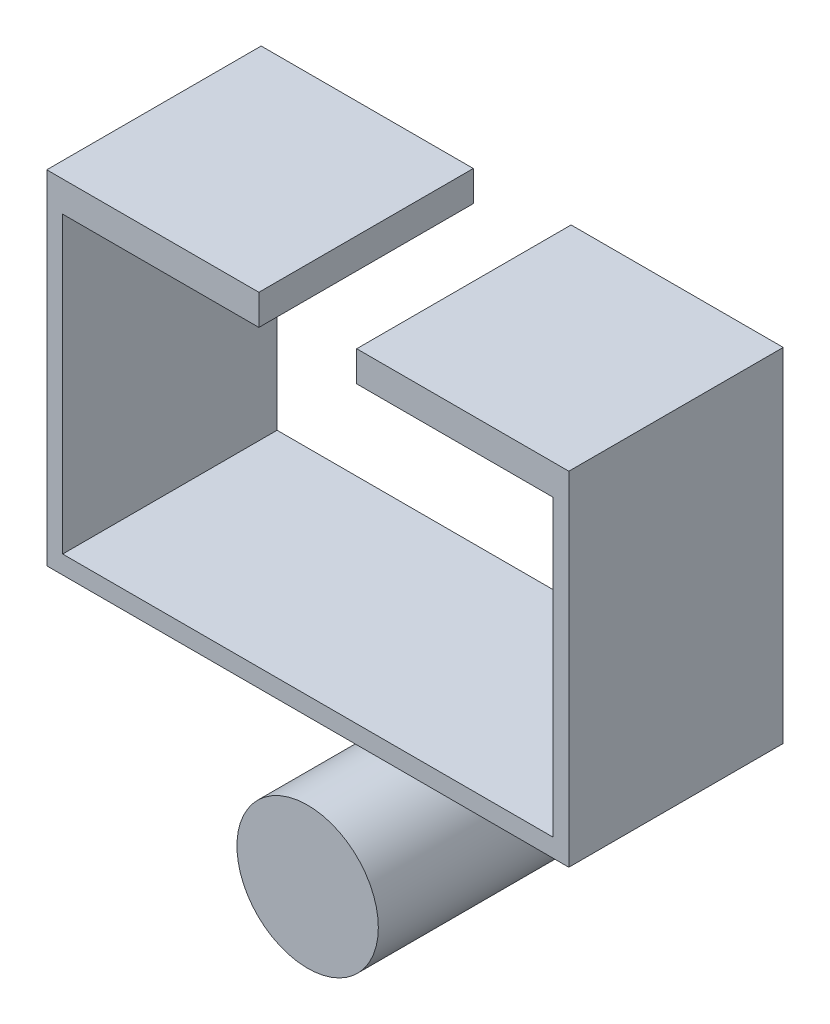
ISO-10303-21;
HEADER;
FILE_DESCRIPTION(('STEP AP214'),'2;1');
FILE_NAME('part.step','',(''),(''),'','','');
FILE_SCHEMA(('AUTOMOTIVE_DESIGN { 1 0 10303 214 1 1 1 1 }'));
ENDSEC;
DATA;
#1=APPLICATION_CONTEXT('core data for automotive mechanical design processes');
#2=APPLICATION_PROTOCOL_DEFINITION('international standard','automotive_design',2000,#1);
#3=PRODUCT_CONTEXT('',#1,'mechanical');
#4=PRODUCT('Part','Part','',(#3));
#5=PRODUCT_RELATED_PRODUCT_CATEGORY('part','',(#4));
#6=PRODUCT_DEFINITION_FORMATION('','',#4);
#7=PRODUCT_DEFINITION_CONTEXT('part definition',#1,'design');
#8=PRODUCT_DEFINITION('design','',#6,#7);
#9=PRODUCT_DEFINITION_SHAPE('','',#8);
#10=(LENGTH_UNIT() NAMED_UNIT(*) SI_UNIT(.MILLI.,.METRE.));
#11=(NAMED_UNIT(*) PLANE_ANGLE_UNIT() SI_UNIT($,.RADIAN.));
#12=(NAMED_UNIT(*) SI_UNIT($,.STERADIAN.) SOLID_ANGLE_UNIT());
#13=UNCERTAINTY_MEASURE_WITH_UNIT(LENGTH_MEASURE(1.E-05),#10,'distance_accuracy_value','');
#14=(GEOMETRIC_REPRESENTATION_CONTEXT(3) GLOBAL_UNCERTAINTY_ASSIGNED_CONTEXT((#13)) GLOBAL_UNIT_ASSIGNED_CONTEXT((#10,
#11,#12)) REPRESENTATION_CONTEXT('',''));
#15=CARTESIAN_POINT('',(0.,0.,0.));
#16=DIRECTION('',(0.,0.,1.));
#17=DIRECTION('',(1.,0.,0.));
#18=AXIS2_PLACEMENT_3D('',#15,#16,#17);
#19=CARTESIAN_POINT('',(-33.76168,0.,27.7315318518519));
#20=DIRECTION('',(0.,1.,0.));
#21=DIRECTION('',(0.,0.,1.));
#22=AXIS2_PLACEMENT_3D('',#19,#20,#21);
#23=PLANE('',#22);
#24=DIRECTION('',(0.,0.,-1.));
#25=VECTOR('',#24,1.);
#26=CARTESIAN_POINT('',(-9.144,0.,2.35185185185186));
#27=LINE('',#26,#25);
#28=CARTESIAN_POINT('',(-9.144,0.,2.35185185185186));
#29=VERTEX_POINT('',#28);
#30=CARTESIAN_POINT('',(-9.144,0.,0.));
#31=VERTEX_POINT('',#30);
#32=EDGE_CURVE('E361',#29,#31,#27,.T.);
#33=ORIENTED_EDGE('',*,*,#32,.F.);
#34=DIRECTION('',(-1.,0.,0.));
#35=VECTOR('',#34,1.);
#36=CARTESIAN_POINT('',(-9.144,0.,2.35185185185186));
#37=LINE('',#36,#35);
#38=CARTESIAN_POINT('',(9.144,0.,2.35185185185186));
#39=VERTEX_POINT('',#38);
#40=EDGE_CURVE('E367',#39,#29,#37,.T.);
#41=ORIENTED_EDGE('',*,*,#40,.F.);
#42=DIRECTION('',(0.,0.,-1.));
#43=VECTOR('',#42,1.);
#44=CARTESIAN_POINT('',(9.144,0.,2.35185185185186));
#45=LINE('',#44,#43);
#46=CARTESIAN_POINT('',(9.144,0.,0.));
#47=VERTEX_POINT('',#46);
#48=EDGE_CURVE('E356',#39,#47,#45,.T.);
#49=ORIENTED_EDGE('',*,*,#48,.T.);
#50=DIRECTION('',(1.,0.,0.));
#51=VECTOR('',#50,1.);
#52=CARTESIAN_POINT('',(-33.76168,0.,0.));
#53=LINE('',#52,#51);
#54=CARTESIAN_POINT('',(33.76168,0.,0.));
#55=VERTEX_POINT('',#54);
#56=EDGE_CURVE('E189',#47,#55,#53,.T.);
#57=ORIENTED_EDGE('',*,*,#56,.T.);
#58=DIRECTION('',(0.,0.,-1.));
#59=VECTOR('',#58,1.);
#60=CARTESIAN_POINT('',(33.76168,0.,27.7315318518519));
#61=LINE('',#60,#59);
#62=CARTESIAN_POINT('',(33.76168,0.,27.7315318518519));
#63=VERTEX_POINT('',#62);
#64=EDGE_CURVE('E55',#63,#55,#61,.T.);
#65=ORIENTED_EDGE('',*,*,#64,.F.);
#66=DIRECTION('',(1.,0.,0.));
#67=VECTOR('',#66,1.);
#68=CARTESIAN_POINT('',(-33.76168,0.,27.7315318518519));
#69=LINE('',#68,#67);
#70=CARTESIAN_POINT('',(-33.76168,0.,27.7315318518519));
#71=VERTEX_POINT('',#70);
#72=EDGE_CURVE('E124',#71,#63,#69,.T.);
#73=ORIENTED_EDGE('',*,*,#72,.F.);
#74=DIRECTION('',(0.,0.,-1.));
#75=VECTOR('',#74,1.);
#76=CARTESIAN_POINT('',(-33.76168,0.,27.7315318518519));
#77=LINE('',#76,#75);
#78=CARTESIAN_POINT('',(-33.76168,0.,0.));
#79=VERTEX_POINT('',#78);
#80=EDGE_CURVE('E11',#71,#79,#77,.T.);
#81=ORIENTED_EDGE('',*,*,#80,.T.);
#82=EDGE_CURVE('E191',#79,#31,#53,.T.);
#83=ORIENTED_EDGE('',*,*,#82,.T.);
#84=EDGE_LOOP('',(#33,#41,#49,#57,#65,#73,#81,#83));
#85=FACE_BOUND('',#84,.T.);
#86=ADVANCED_FACE('F46',(#85),#23,.F.);
#87=CARTESIAN_POINT('',(-33.76168,0.,27.7315318518519));
#88=DIRECTION('',(1.,0.,0.));
#89=DIRECTION('',(0.,1.,0.));
#90=AXIS2_PLACEMENT_3D('',#87,#88,#89);
#91=PLANE('',#90);
#92=DIRECTION('',(0.,-1.,0.));
#93=VECTOR('',#92,1.);
#94=CARTESIAN_POINT('',(-33.76168,0.,0.));
#95=LINE('',#94,#93);
#96=CARTESIAN_POINT('',(-33.76168,44.3634518518519,0.));
#97=VERTEX_POINT('',#96);
#98=EDGE_CURVE('E185',#97,#79,#95,.T.);
#99=ORIENTED_EDGE('',*,*,#98,.T.);
#100=ORIENTED_EDGE('',*,*,#80,.F.);
#101=DIRECTION('',(0.,-1.,0.));
#102=VECTOR('',#101,1.);
#103=CARTESIAN_POINT('',(-33.76168,0.,27.7315318518519));
#104=LINE('',#103,#102);
#105=CARTESIAN_POINT('',(-33.76168,44.3634518518519,27.7315318518519));
#106=VERTEX_POINT('',#105);
#107=EDGE_CURVE('E223',#106,#71,#104,.T.);
#108=ORIENTED_EDGE('',*,*,#107,.F.);
#109=DIRECTION('',(0.,0.,-1.));
#110=VECTOR('',#109,1.);
#111=CARTESIAN_POINT('',(-33.76168,44.3634518518519,27.7315318518519));
#112=LINE('',#111,#110);
#113=EDGE_CURVE('E181',#106,#97,#112,.T.);
#114=ORIENTED_EDGE('',*,*,#113,.T.);
#115=EDGE_LOOP('',(#99,#100,#108,#114));
#116=FACE_BOUND('',#115,.T.);
#117=ADVANCED_FACE('F48',(#116),#91,.F.);
#118=CARTESIAN_POINT('',(33.76168,44.3634518518519,27.7315318518519));
#119=DIRECTION('',(-1.,0.,0.));
#120=DIRECTION('',(0.,-1.,0.));
#121=AXIS2_PLACEMENT_3D('',#118,#119,#120);
#122=PLANE('',#121);
#123=DIRECTION('',(0.,1.,0.));
#124=VECTOR('',#123,1.);
#125=CARTESIAN_POINT('',(33.76168,44.3634518518519,0.));
#126=LINE('',#125,#124);
#127=CARTESIAN_POINT('',(33.76168,44.3634518518519,0.));
#128=VERTEX_POINT('',#127);
#129=EDGE_CURVE('E195',#55,#128,#126,.T.);
#130=ORIENTED_EDGE('',*,*,#129,.T.);
#131=DIRECTION('',(0.,0.,-1.));
#132=VECTOR('',#131,1.);
#133=CARTESIAN_POINT('',(33.76168,44.3634518518519,27.7315318518519));
#134=LINE('',#133,#132);
#135=CARTESIAN_POINT('',(33.76168,44.3634518518519,27.7315318518519));
#136=VERTEX_POINT('',#135);
#137=EDGE_CURVE('E250',#136,#128,#134,.T.);
#138=ORIENTED_EDGE('',*,*,#137,.F.);
#139=DIRECTION('',(0.,1.,0.));
#140=VECTOR('',#139,1.);
#141=CARTESIAN_POINT('',(33.76168,44.3634518518519,27.7315318518519));
#142=LINE('',#141,#140);
#143=EDGE_CURVE('E261',#63,#136,#142,.T.);
#144=ORIENTED_EDGE('',*,*,#143,.F.);
#145=ORIENTED_EDGE('',*,*,#64,.T.);
#146=EDGE_LOOP('',(#130,#138,#144,#145));
#147=FACE_BOUND('',#146,.T.);
#148=ADVANCED_FACE('F259',(#147),#122,.F.);
#149=CARTESIAN_POINT('',(6.32460000000001,44.3634518518519,27.7315318518519));
#150=DIRECTION('',(0.,-1.,0.));
#151=DIRECTION('',(0.,0.,-1.));
#152=AXIS2_PLACEMENT_3D('',#149,#150,#151);
#153=PLANE('',#152);
#154=DIRECTION('',(-1.,0.,0.));
#155=VECTOR('',#154,1.);
#156=CARTESIAN_POINT('',(6.32460000000001,44.3634518518519,0.));
#157=LINE('',#156,#155);
#158=CARTESIAN_POINT('',(6.32460000000001,44.3634518518519,0.));
#159=VERTEX_POINT('',#158);
#160=EDGE_CURVE('E198',#128,#159,#157,.T.);
#161=ORIENTED_EDGE('',*,*,#160,.T.);
#162=DIRECTION('',(0.,0.,-1.));
#163=VECTOR('',#162,1.);
#164=CARTESIAN_POINT('',(6.32460000000001,44.3634518518519,27.7315318518519));
#165=LINE('',#164,#163);
#166=CARTESIAN_POINT('',(6.32460000000001,44.3634518518519,27.7315318518519));
#167=VERTEX_POINT('',#166);
#168=EDGE_CURVE('E246',#167,#159,#165,.T.);
#169=ORIENTED_EDGE('',*,*,#168,.F.);
#170=DIRECTION('',(-1.,0.,0.));
#171=VECTOR('',#170,1.);
#172=CARTESIAN_POINT('',(6.32460000000001,44.3634518518519,27.7315318518519));
#173=LINE('',#172,#171);
#174=EDGE_CURVE('E281',#136,#167,#173,.T.);
#175=ORIENTED_EDGE('',*,*,#174,.F.);
#176=ORIENTED_EDGE('',*,*,#137,.T.);
#177=EDGE_LOOP('',(#161,#169,#175,#176));
#178=FACE_BOUND('',#177,.T.);
#179=ADVANCED_FACE('F271',(#178),#153,.F.);
#180=CARTESIAN_POINT('',(6.32460000000001,40.4264518518519,27.7315318518519));
#181=DIRECTION('',(1.,0.,0.));
#182=DIRECTION('',(0.,0.,-1.));
#183=AXIS2_PLACEMENT_3D('',#180,#181,#182);
#184=PLANE('',#183);
#185=DIRECTION('',(0.,-1.,0.));
#186=VECTOR('',#185,1.);
#187=CARTESIAN_POINT('',(6.32460000000001,40.4264518518519,0.));
#188=LINE('',#187,#186);
#189=CARTESIAN_POINT('',(6.32460000000001,40.4264518518519,0.));
#190=VERTEX_POINT('',#189);
#191=EDGE_CURVE('E201',#159,#190,#188,.T.);
#192=ORIENTED_EDGE('',*,*,#191,.T.);
#193=DIRECTION('',(0.,0.,-1.));
#194=VECTOR('',#193,1.);
#195=CARTESIAN_POINT('',(6.32460000000001,40.4264518518519,27.7315318518519));
#196=LINE('',#195,#194);
#197=CARTESIAN_POINT('',(6.32460000000001,40.4264518518519,27.7315318518519));
#198=VERTEX_POINT('',#197);
#199=EDGE_CURVE('E242',#198,#190,#196,.T.);
#200=ORIENTED_EDGE('',*,*,#199,.F.);
#201=DIRECTION('',(0.,-1.,0.));
#202=VECTOR('',#201,1.);
#203=CARTESIAN_POINT('',(6.32460000000001,40.4264518518519,27.7315318518519));
#204=LINE('',#203,#202);
#205=EDGE_CURVE('E277',#167,#198,#204,.T.);
#206=ORIENTED_EDGE('',*,*,#205,.F.);
#207=ORIENTED_EDGE('',*,*,#168,.T.);
#208=EDGE_LOOP('',(#192,#200,#206,#207));
#209=FACE_BOUND('',#208,.T.);
#210=ADVANCED_FACE('F275',(#209),#184,.F.);
#211=CARTESIAN_POINT('',(31.70428,40.4264518518519,27.7315318518519));
#212=DIRECTION('',(0.,1.,0.));
#213=DIRECTION('',(-1.,0.,0.));
#214=AXIS2_PLACEMENT_3D('',#211,#212,#213);
#215=PLANE('',#214);
#216=DIRECTION('',(1.,0.,0.));
#217=VECTOR('',#216,1.);
#218=CARTESIAN_POINT('',(31.70428,40.4264518518519,0.));
#219=LINE('',#218,#217);
#220=CARTESIAN_POINT('',(31.70428,40.4264518518519,0.));
#221=VERTEX_POINT('',#220);
#222=EDGE_CURVE('E204',#190,#221,#219,.T.);
#223=ORIENTED_EDGE('',*,*,#222,.T.);
#224=DIRECTION('',(0.,0.,-1.));
#225=VECTOR('',#224,1.);
#226=CARTESIAN_POINT('',(31.70428,40.4264518518519,27.7315318518519));
#227=LINE('',#226,#225);
#228=CARTESIAN_POINT('',(31.70428,40.4264518518519,27.7315318518519));
#229=VERTEX_POINT('',#228);
#230=EDGE_CURVE('E238',#229,#221,#227,.T.);
#231=ORIENTED_EDGE('',*,*,#230,.F.);
#232=DIRECTION('',(1.,0.,0.));
#233=VECTOR('',#232,1.);
#234=CARTESIAN_POINT('',(31.70428,40.4264518518519,27.7315318518519));
#235=LINE('',#234,#233);
#236=EDGE_CURVE('E280',#198,#229,#235,.T.);
#237=ORIENTED_EDGE('',*,*,#236,.F.);
#238=ORIENTED_EDGE('',*,*,#199,.T.);
#239=EDGE_LOOP('',(#223,#231,#237,#238));
#240=FACE_BOUND('',#239,.T.);
#241=ADVANCED_FACE('F461',(#240),#215,.F.);
#242=CARTESIAN_POINT('',(31.70428,2.35185185185186,27.7315318518519));
#243=DIRECTION('',(1.,0.,0.));
#244=DIRECTION('',(0.,1.,0.));
#245=AXIS2_PLACEMENT_3D('',#242,#243,#244);
#246=PLANE('',#245);
#247=DIRECTION('',(0.,-1.,0.));
#248=VECTOR('',#247,1.);
#249=CARTESIAN_POINT('',(31.70428,2.35185185185186,0.));
#250=LINE('',#249,#248);
#251=CARTESIAN_POINT('',(31.70428,2.35185185185186,0.));
#252=VERTEX_POINT('',#251);
#253=EDGE_CURVE('E207',#221,#252,#250,.T.);
#254=ORIENTED_EDGE('',*,*,#253,.T.);
#255=DIRECTION('',(0.,0.,-1.));
#256=VECTOR('',#255,1.);
#257=CARTESIAN_POINT('',(31.70428,2.35185185185186,27.7315318518519));
#258=LINE('',#257,#256);
#259=CARTESIAN_POINT('',(31.70428,2.35185185185186,27.7315318518519));
#260=VERTEX_POINT('',#259);
#261=EDGE_CURVE('E234',#260,#252,#258,.T.);
#262=ORIENTED_EDGE('',*,*,#261,.F.);
#263=DIRECTION('',(0.,-1.,0.));
#264=VECTOR('',#263,1.);
#265=CARTESIAN_POINT('',(31.70428,2.35185185185186,27.7315318518519));
#266=LINE('',#265,#264);
#267=EDGE_CURVE('E286',#229,#260,#266,.T.);
#268=ORIENTED_EDGE('',*,*,#267,.F.);
#269=ORIENTED_EDGE('',*,*,#230,.T.);
#270=EDGE_LOOP('',(#254,#262,#268,#269));
#271=FACE_BOUND('',#270,.T.);
#272=ADVANCED_FACE('F464',(#271),#246,.F.);
#273=CARTESIAN_POINT('',(-31.70428,2.35185185185186,27.7315318518519));
#274=DIRECTION('',(0.,-1.,0.));
#275=DIRECTION('',(0.,0.,-1.));
#276=AXIS2_PLACEMENT_3D('',#273,#274,#275);
#277=PLANE('',#276);
#278=DIRECTION('',(-1.,0.,0.));
#279=VECTOR('',#278,1.);
#280=CARTESIAN_POINT('',(-31.70428,2.35185185185186,0.));
#281=LINE('',#280,#279);
#282=CARTESIAN_POINT('',(-31.70428,2.35185185185186,0.));
#283=VERTEX_POINT('',#282);
#284=EDGE_CURVE('E210',#252,#283,#281,.T.);
#285=ORIENTED_EDGE('',*,*,#284,.T.);
#286=DIRECTION('',(0.,0.,-1.));
#287=VECTOR('',#286,1.);
#288=CARTESIAN_POINT('',(-31.70428,2.35185185185186,27.7315318518519));
#289=LINE('',#288,#287);
#290=CARTESIAN_POINT('',(-31.70428,2.35185185185186,27.7315318518519));
#291=VERTEX_POINT('',#290);
#292=EDGE_CURVE('E230',#291,#283,#289,.T.);
#293=ORIENTED_EDGE('',*,*,#292,.F.);
#294=DIRECTION('',(-1.,0.,0.));
#295=VECTOR('',#294,1.);
#296=CARTESIAN_POINT('',(-31.70428,2.35185185185186,27.7315318518519));
#297=LINE('',#296,#295);
#298=EDGE_CURVE('E293',#260,#291,#297,.T.);
#299=ORIENTED_EDGE('',*,*,#298,.F.);
#300=ORIENTED_EDGE('',*,*,#261,.T.);
#301=EDGE_LOOP('',(#285,#293,#299,#300));
#302=FACE_BOUND('',#301,.T.);
#303=ADVANCED_FACE('F468',(#302),#277,.F.);
#304=CARTESIAN_POINT('',(-31.70428,40.4264518518519,27.7315318518519));
#305=DIRECTION('',(-1.,0.,0.));
#306=DIRECTION('',(0.,-1.,0.));
#307=AXIS2_PLACEMENT_3D('',#304,#305,#306);
#308=PLANE('',#307);
#309=DIRECTION('',(0.,1.,0.));
#310=VECTOR('',#309,1.);
#311=CARTESIAN_POINT('',(-31.70428,40.4264518518519,0.));
#312=LINE('',#311,#310);
#313=CARTESIAN_POINT('',(-31.70428,40.4264518518519,0.));
#314=VERTEX_POINT('',#313);
#315=EDGE_CURVE('E213',#283,#314,#312,.T.);
#316=ORIENTED_EDGE('',*,*,#315,.T.);
#317=DIRECTION('',(0.,0.,-1.));
#318=VECTOR('',#317,1.);
#319=CARTESIAN_POINT('',(-31.70428,40.4264518518519,27.7315318518519));
#320=LINE('',#319,#318);
#321=CARTESIAN_POINT('',(-31.70428,40.4264518518519,27.7315318518519));
#322=VERTEX_POINT('',#321);
#323=EDGE_CURVE('E173',#322,#314,#320,.T.);
#324=ORIENTED_EDGE('',*,*,#323,.F.);
#325=DIRECTION('',(0.,1.,0.));
#326=VECTOR('',#325,1.);
#327=CARTESIAN_POINT('',(-31.70428,40.4264518518519,27.7315318518519));
#328=LINE('',#327,#326);
#329=EDGE_CURVE('E159',#291,#322,#328,.T.);
#330=ORIENTED_EDGE('',*,*,#329,.F.);
#331=ORIENTED_EDGE('',*,*,#292,.T.);
#332=EDGE_LOOP('',(#316,#324,#330,#331));
#333=FACE_BOUND('',#332,.T.);
#334=ADVANCED_FACE('F472',(#333),#308,.F.);
#335=CARTESIAN_POINT('',(-6.3246,40.4264518518519,27.7315318518519));
#336=DIRECTION('',(0.,1.,0.));
#337=DIRECTION('',(-1.,0.,0.));
#338=AXIS2_PLACEMENT_3D('',#335,#336,#337);
#339=PLANE('',#338);
#340=DIRECTION('',(1.,0.,0.));
#341=VECTOR('',#340,1.);
#342=CARTESIAN_POINT('',(-6.3246,40.4264518518519,0.));
#343=LINE('',#342,#341);
#344=CARTESIAN_POINT('',(-6.3246,40.4264518518519,0.));
#345=VERTEX_POINT('',#344);
#346=EDGE_CURVE('E169',#314,#345,#343,.T.);
#347=ORIENTED_EDGE('',*,*,#346,.T.);
#348=DIRECTION('',(0.,0.,-1.));
#349=VECTOR('',#348,1.);
#350=CARTESIAN_POINT('',(-6.3246,40.4264518518519,27.7315318518519));
#351=LINE('',#350,#349);
#352=CARTESIAN_POINT('',(-6.3246,40.4264518518519,27.7315318518519));
#353=VERTEX_POINT('',#352);
#354=EDGE_CURVE('E166',#353,#345,#351,.T.);
#355=ORIENTED_EDGE('',*,*,#354,.F.);
#356=DIRECTION('',(1.,0.,0.));
#357=VECTOR('',#356,1.);
#358=CARTESIAN_POINT('',(-6.3246,40.4264518518519,27.7315318518519));
#359=LINE('',#358,#357);
#360=EDGE_CURVE('E152',#322,#353,#359,.T.);
#361=ORIENTED_EDGE('',*,*,#360,.F.);
#362=ORIENTED_EDGE('',*,*,#323,.T.);
#363=EDGE_LOOP('',(#347,#355,#361,#362));
#364=FACE_BOUND('',#363,.T.);
#365=ADVANCED_FACE('F167',(#364),#339,.F.);
#366=CARTESIAN_POINT('',(-6.3246,44.3634518518519,27.7315318518519));
#367=DIRECTION('',(-1.,0.,0.));
#368=DIRECTION('',(0.,-1.,0.));
#369=AXIS2_PLACEMENT_3D('',#366,#367,#368);
#370=PLANE('',#369);
#371=DIRECTION('',(0.,1.,0.));
#372=VECTOR('',#371,1.);
#373=CARTESIAN_POINT('',(-6.3246,44.3634518518519,0.));
#374=LINE('',#373,#372);
#375=CARTESIAN_POINT('',(-6.3246,44.3634518518519,0.));
#376=VERTEX_POINT('',#375);
#377=EDGE_CURVE('E218',#345,#376,#374,.T.);
#378=ORIENTED_EDGE('',*,*,#377,.T.);
#379=DIRECTION('',(0.,0.,-1.));
#380=VECTOR('',#379,1.);
#381=CARTESIAN_POINT('',(-6.3246,44.3634518518519,27.7315318518519));
#382=LINE('',#381,#380);
#383=CARTESIAN_POINT('',(-6.3246,44.3634518518519,27.7315318518519));
#384=VERTEX_POINT('',#383);
#385=EDGE_CURVE('E174',#384,#376,#382,.T.);
#386=ORIENTED_EDGE('',*,*,#385,.F.);
#387=DIRECTION('',(0.,1.,0.));
#388=VECTOR('',#387,1.);
#389=CARTESIAN_POINT('',(-6.3246,44.3634518518519,27.7315318518519));
#390=LINE('',#389,#388);
#391=EDGE_CURVE('E156',#353,#384,#390,.T.);
#392=ORIENTED_EDGE('',*,*,#391,.F.);
#393=ORIENTED_EDGE('',*,*,#354,.T.);
#394=EDGE_LOOP('',(#378,#386,#392,#393));
#395=FACE_BOUND('',#394,.T.);
#396=ADVANCED_FACE('F176',(#395),#370,.F.);
#397=CARTESIAN_POINT('',(-33.76168,44.3634518518519,27.7315318518519));
#398=DIRECTION('',(0.,-1.,0.));
#399=DIRECTION('',(0.,0.,-1.));
#400=AXIS2_PLACEMENT_3D('',#397,#398,#399);
#401=PLANE('',#400);
#402=DIRECTION('',(-1.,0.,0.));
#403=VECTOR('',#402,1.);
#404=CARTESIAN_POINT('',(-33.76168,44.3634518518519,0.));
#405=LINE('',#404,#403);
#406=EDGE_CURVE('E116',#376,#97,#405,.T.);
#407=ORIENTED_EDGE('',*,*,#406,.T.);
#408=ORIENTED_EDGE('',*,*,#113,.F.);
#409=DIRECTION('',(-1.,0.,0.));
#410=VECTOR('',#409,1.);
#411=CARTESIAN_POINT('',(-33.76168,44.3634518518519,27.7315318518519));
#412=LINE('',#411,#410);
#413=EDGE_CURVE('E71',#384,#106,#412,.T.);
#414=ORIENTED_EDGE('',*,*,#413,.F.);
#415=ORIENTED_EDGE('',*,*,#385,.T.);
#416=EDGE_LOOP('',(#407,#408,#414,#415));
#417=FACE_BOUND('',#416,.T.);
#418=ADVANCED_FACE('F439',(#417),#401,.F.);
#419=CARTESIAN_POINT('',(0.,0.,27.7315318518519));
#420=DIRECTION('',(0.,0.,-1.));
#421=DIRECTION('',(-1.,0.,0.));
#422=AXIS2_PLACEMENT_3D('',#419,#420,#421);
#423=PLANE('',#422);
#424=ORIENTED_EDGE('',*,*,#107,.T.);
#425=ORIENTED_EDGE('',*,*,#72,.T.);
#426=ORIENTED_EDGE('',*,*,#143,.T.);
#427=ORIENTED_EDGE('',*,*,#174,.T.);
#428=ORIENTED_EDGE('',*,*,#205,.T.);
#429=ORIENTED_EDGE('',*,*,#236,.T.);
#430=ORIENTED_EDGE('',*,*,#267,.T.);
#431=ORIENTED_EDGE('',*,*,#298,.T.);
#432=ORIENTED_EDGE('',*,*,#329,.T.);
#433=ORIENTED_EDGE('',*,*,#360,.T.);
#434=ORIENTED_EDGE('',*,*,#391,.T.);
#435=ORIENTED_EDGE('',*,*,#413,.T.);
#436=EDGE_LOOP('',(#424,#425,#426,#427,#428,#429,#430,#431,#432,#433,#434,#435));
#437=FACE_BOUND('',#436,.T.);
#438=ADVANCED_FACE('F154',(#437),#423,.F.);
#439=CARTESIAN_POINT('',(0.,0.,0.));
#440=DIRECTION('',(0.,0.,-1.));
#441=DIRECTION('',(-1.,0.,0.));
#442=AXIS2_PLACEMENT_3D('',#439,#440,#441);
#443=PLANE('',#442);
#444=ORIENTED_EDGE('',*,*,#98,.F.);
#445=ORIENTED_EDGE('',*,*,#406,.F.);
#446=ORIENTED_EDGE('',*,*,#377,.F.);
#447=ORIENTED_EDGE('',*,*,#346,.F.);
#448=ORIENTED_EDGE('',*,*,#315,.F.);
#449=ORIENTED_EDGE('',*,*,#284,.F.);
#450=ORIENTED_EDGE('',*,*,#253,.F.);
#451=ORIENTED_EDGE('',*,*,#222,.F.);
#452=ORIENTED_EDGE('',*,*,#191,.F.);
#453=ORIENTED_EDGE('',*,*,#160,.F.);
#454=ORIENTED_EDGE('',*,*,#129,.F.);
#455=ORIENTED_EDGE('',*,*,#56,.F.);
#456=DIRECTION('',(0.,1.,0.));
#457=VECTOR('',#456,1.);
#458=CARTESIAN_POINT('',(9.144,0.,0.));
#459=LINE('',#458,#457);
#460=CARTESIAN_POINT('',(9.144,-19.05,0.));
#461=VERTEX_POINT('',#460);
#462=EDGE_CURVE('E62',#461,#47,#459,.T.);
#463=ORIENTED_EDGE('',*,*,#462,.F.);
#464=CARTESIAN_POINT('',(0.,-19.05,0.));
#465=DIRECTION('',(0.,0.,1.));
#466=DIRECTION('',(1.,0.,0.));
#467=AXIS2_PLACEMENT_3D('',#464,#465,#466);
#468=CIRCLE('',#467,9.144);
#469=CARTESIAN_POINT('',(-9.144,-19.05,0.));
#470=VERTEX_POINT('',#469);
#471=EDGE_CURVE('E389',#470,#461,#468,.T.);
#472=ORIENTED_EDGE('',*,*,#471,.F.);
#473=DIRECTION('',(0.,-1.,0.));
#474=VECTOR('',#473,1.);
#475=CARTESIAN_POINT('',(-9.144,0.,0.));
#476=LINE('',#475,#474);
#477=EDGE_CURVE('E395',#31,#470,#476,.T.);
#478=ORIENTED_EDGE('',*,*,#477,.F.);
#479=ORIENTED_EDGE('',*,*,#82,.F.);
#480=EDGE_LOOP('',(#444,#445,#446,#447,#448,#449,#450,#451,#452,#453,#454,#455,#463,#472,#478,#479));
#481=FACE_BOUND('',#480,.T.);
#482=ADVANCED_FACE('F266',(#481),#443,.T.);
#483=CARTESIAN_POINT('',(-9.144,0.,2.35185185185186));
#484=DIRECTION('',(1.,0.,0.));
#485=DIRECTION('',(0.,1.,0.));
#486=AXIS2_PLACEMENT_3D('',#483,#484,#485);
#487=PLANE('',#486);
#488=ORIENTED_EDGE('',*,*,#477,.T.);
#489=DIRECTION('',(0.,0.,-1.));
#490=VECTOR('',#489,1.);
#491=CARTESIAN_POINT('',(-9.144,-19.05,2.35185185185186));
#492=LINE('',#491,#490);
#493=CARTESIAN_POINT('',(-9.144,-19.05,2.35185185185186));
#494=VERTEX_POINT('',#493);
#495=EDGE_CURVE('E190',#494,#470,#492,.T.);
#496=ORIENTED_EDGE('',*,*,#495,.F.);
#497=DIRECTION('',(0.,-1.,0.));
#498=VECTOR('',#497,1.);
#499=CARTESIAN_POINT('',(-9.144,0.,2.35185185185186));
#500=LINE('',#499,#498);
#501=EDGE_CURVE('E379',#29,#494,#500,.T.);
#502=ORIENTED_EDGE('',*,*,#501,.F.);
#503=ORIENTED_EDGE('',*,*,#32,.T.);
#504=EDGE_LOOP('',(#488,#496,#502,#503));
#505=FACE_BOUND('',#504,.T.);
#506=ADVANCED_FACE('F430',(#505),#487,.F.);
#507=CARTESIAN_POINT('',(0.,-19.05,2.35185185185186));
#508=DIRECTION('',(0.,0.,-1.));
#509=DIRECTION('',(-1.,0.,0.));
#510=AXIS2_PLACEMENT_3D('',#507,#508,#509);
#511=CYLINDRICAL_SURFACE('',#510,9.144);
#512=ORIENTED_EDGE('',*,*,#471,.T.);
#513=DIRECTION('',(0.,0.,-1.));
#514=VECTOR('',#513,1.);
#515=CARTESIAN_POINT('',(9.144,-19.05,2.35185185185186));
#516=LINE('',#515,#514);
#517=CARTESIAN_POINT('',(9.144,-19.05,2.35185185185186));
#518=VERTEX_POINT('',#517);
#519=EDGE_CURVE('E351',#518,#461,#516,.T.);
#520=ORIENTED_EDGE('',*,*,#519,.F.);
#521=CARTESIAN_POINT('',(0.,-19.05,2.35185185185186));
#522=DIRECTION('',(0.,0.,1.));
#523=DIRECTION('',(1.,0.,0.));
#524=AXIS2_PLACEMENT_3D('',#521,#522,#523);
#525=CIRCLE('',#524,9.144);
#526=EDGE_CURVE('E407',#518,#494,#525,.T.);
#527=ORIENTED_EDGE('',*,*,#526,.T.);
#528=ORIENTED_EDGE('',*,*,#495,.T.);
#529=EDGE_LOOP('',(#512,#520,#527,#528));
#530=FACE_BOUND('',#529,.T.);
#531=CARTESIAN_POINT('',(0.,-19.05,27.7518518518519));
#532=DIRECTION('',(0.,0.,1.));
#533=DIRECTION('',(1.,0.,0.));
#534=AXIS2_PLACEMENT_3D('',#531,#532,#533);
#535=CIRCLE('',#534,9.144);
#536=CARTESIAN_POINT('',(9.144,-19.05,27.7518518518519));
#537=VERTEX_POINT('',#536);
#538=EDGE_CURVE('E401',#537,#537,#535,.T.);
#539=ORIENTED_EDGE('',*,*,#538,.F.);
#540=EDGE_LOOP('',(#539));
#541=FACE_BOUND('',#540,.T.);
#542=ADVANCED_FACE('F417',(#530,#541),#511,.T.);
#543=CARTESIAN_POINT('',(9.144,0.,2.35185185185186));
#544=DIRECTION('',(-1.,0.,0.));
#545=DIRECTION('',(0.,-1.,0.));
#546=AXIS2_PLACEMENT_3D('',#543,#544,#545);
#547=PLANE('',#546);
#548=ORIENTED_EDGE('',*,*,#462,.T.);
#549=ORIENTED_EDGE('',*,*,#48,.F.);
#550=DIRECTION('',(0.,1.,0.));
#551=VECTOR('',#550,1.);
#552=CARTESIAN_POINT('',(9.144,0.,2.35185185185186));
#553=LINE('',#552,#551);
#554=EDGE_CURVE('E373',#518,#39,#553,.T.);
#555=ORIENTED_EDGE('',*,*,#554,.F.);
#556=ORIENTED_EDGE('',*,*,#519,.T.);
#557=EDGE_LOOP('',(#548,#549,#555,#556));
#558=FACE_BOUND('',#557,.T.);
#559=ADVANCED_FACE('F525',(#558),#547,.F.);
#560=CARTESIAN_POINT('',(0.,-19.05,2.35185185185186));
#561=DIRECTION('',(0.,0.,1.));
#562=DIRECTION('',(1.,0.,0.));
#563=AXIS2_PLACEMENT_3D('',#560,#561,#562);
#564=PLANE('',#563);
#565=ORIENTED_EDGE('',*,*,#501,.T.);
#566=ORIENTED_EDGE('',*,*,#526,.F.);
#567=ORIENTED_EDGE('',*,*,#554,.T.);
#568=ORIENTED_EDGE('',*,*,#40,.T.);
#569=EDGE_LOOP('',(#565,#566,#567,#568));
#570=FACE_BOUND('',#569,.T.);
#571=ADVANCED_FACE('F426',(#570),#564,.T.);
#572=CARTESIAN_POINT('',(0.,-19.05,27.7518518518519));
#573=DIRECTION('',(0.,0.,1.));
#574=DIRECTION('',(1.,0.,0.));
#575=AXIS2_PLACEMENT_3D('',#572,#573,#574);
#576=PLANE('',#575);
#577=ORIENTED_EDGE('',*,*,#538,.T.);
#578=EDGE_LOOP('',(#577));
#579=FACE_BOUND('',#578,.T.);
#580=ADVANCED_FACE('F541',(#579),#576,.T.);
#581=CLOSED_SHELL('',(#86,#117,#148,#179,#210,#241,#272,#303,#334,#365,#396,#418,#438,#482,#506,
#542,#559,#571,#580));
#582=MANIFOLD_SOLID_BREP('B2',#581);
#583=ADVANCED_BREP_SHAPE_REPRESENTATION('',(#18,#582),#14);
#584=SHAPE_DEFINITION_REPRESENTATION(#9,#583);
ENDSEC;
END-ISO-10303-21;
